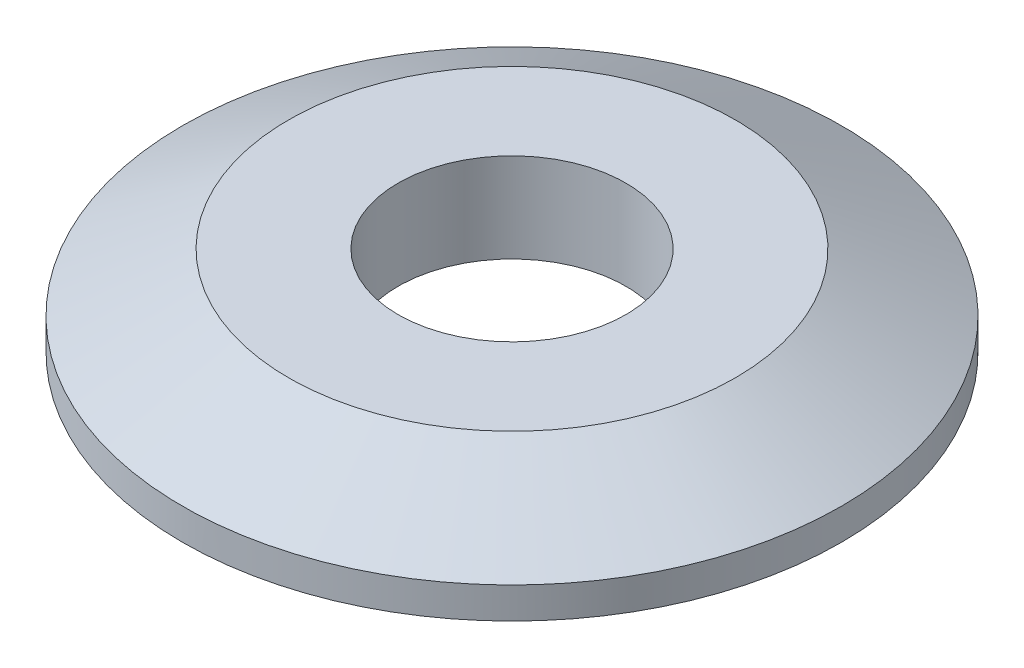
ISO-10303-21;
HEADER;
FILE_DESCRIPTION(('STEP AP214'),'2;1');
FILE_NAME('part.step','',(''),(''),'','','');
FILE_SCHEMA(('AUTOMOTIVE_DESIGN { 1 0 10303 214 1 1 1 1 }'));
ENDSEC;
DATA;
#1=APPLICATION_CONTEXT('core data for automotive mechanical design processes');
#2=APPLICATION_PROTOCOL_DEFINITION('international standard','automotive_design',2000,#1);
#3=PRODUCT_CONTEXT('',#1,'mechanical');
#4=PRODUCT('Part','Part','',(#3));
#5=PRODUCT_RELATED_PRODUCT_CATEGORY('part','',(#4));
#6=PRODUCT_DEFINITION_FORMATION('','',#4);
#7=PRODUCT_DEFINITION_CONTEXT('part definition',#1,'design');
#8=PRODUCT_DEFINITION('design','',#6,#7);
#9=PRODUCT_DEFINITION_SHAPE('','',#8);
#10=(LENGTH_UNIT() NAMED_UNIT(*) SI_UNIT(.MILLI.,.METRE.));
#11=(NAMED_UNIT(*) PLANE_ANGLE_UNIT() SI_UNIT($,.RADIAN.));
#12=(NAMED_UNIT(*) SI_UNIT($,.STERADIAN.) SOLID_ANGLE_UNIT());
#13=UNCERTAINTY_MEASURE_WITH_UNIT(LENGTH_MEASURE(1.E-05),#10,'distance_accuracy_value','');
#14=(GEOMETRIC_REPRESENTATION_CONTEXT(3) GLOBAL_UNCERTAINTY_ASSIGNED_CONTEXT((#13)) GLOBAL_UNIT_ASSIGNED_CONTEXT((#10,
#11,#12)) REPRESENTATION_CONTEXT('',''));
#15=CARTESIAN_POINT('',(0.,0.,0.));
#16=DIRECTION('',(0.,0.,1.));
#17=DIRECTION('',(1.,0.,0.));
#18=AXIS2_PLACEMENT_3D('',#15,#16,#17);
#19=CARTESIAN_POINT('',(0.,2.,0.));
#20=DIRECTION('',(0.,1.,0.));
#21=DIRECTION('',(0.,0.,1.));
#22=AXIS2_PLACEMENT_3D('',#19,#20,#21);
#23=PLANE('',#22);
#24=CARTESIAN_POINT('',(0.,2.,0.));
#25=DIRECTION('',(0.,-1.,0.));
#26=DIRECTION('',(1.,0.,0.));
#27=AXIS2_PLACEMENT_3D('',#24,#25,#26);
#28=CIRCLE('',#27,5.);
#29=CARTESIAN_POINT('',(5.,2.,0.));
#30=VERTEX_POINT('',#29);
#31=EDGE_CURVE('E50',#30,#30,#28,.T.);
#32=ORIENTED_EDGE('',*,*,#31,.F.);
#33=EDGE_LOOP('',(#32));
#34=FACE_BOUND('',#33,.T.);
#35=CARTESIAN_POINT('',(0.,2.,0.));
#36=DIRECTION('',(0.,1.,0.));
#37=DIRECTION('',(0.,0.,1.));
#38=AXIS2_PLACEMENT_3D('',#35,#36,#37);
#39=CIRCLE('',#38,2.55);
#40=CARTESIAN_POINT('',(0.,2.,2.55));
#41=VERTEX_POINT('',#40);
#42=EDGE_CURVE('E37',#41,#41,#39,.T.);
#43=ORIENTED_EDGE('',*,*,#42,.F.);
#44=EDGE_LOOP('',(#43));
#45=FACE_BOUND('',#44,.T.);
#46=ADVANCED_FACE('F30',(#34,#45),#23,.T.);
#47=CARTESIAN_POINT('',(0.,0.,0.));
#48=DIRECTION('',(0.,1.,0.));
#49=DIRECTION('',(0.,0.,1.));
#50=AXIS2_PLACEMENT_3D('',#47,#48,#49);
#51=PLANE('',#50);
#52=CARTESIAN_POINT('',(0.,0.,0.));
#53=DIRECTION('',(0.,1.,0.));
#54=DIRECTION('',(0.,0.,1.));
#55=AXIS2_PLACEMENT_3D('',#52,#53,#54);
#56=CIRCLE('',#55,7.375);
#57=CARTESIAN_POINT('',(0.,0.,7.375));
#58=VERTEX_POINT('',#57);
#59=EDGE_CURVE('E10',#58,#58,#56,.T.);
#60=ORIENTED_EDGE('',*,*,#59,.F.);
#61=EDGE_LOOP('',(#60));
#62=FACE_BOUND('',#61,.T.);
#63=CARTESIAN_POINT('',(0.,0.,0.));
#64=DIRECTION('',(0.,1.,0.));
#65=DIRECTION('',(0.,0.,1.));
#66=AXIS2_PLACEMENT_3D('',#63,#64,#65);
#67=CIRCLE('',#66,2.55);
#68=CARTESIAN_POINT('',(0.,0.,2.55));
#69=VERTEX_POINT('',#68);
#70=EDGE_CURVE('E41',#69,#69,#67,.T.);
#71=ORIENTED_EDGE('',*,*,#70,.T.);
#72=EDGE_LOOP('',(#71));
#73=FACE_BOUND('',#72,.T.);
#74=ADVANCED_FACE('F58',(#62,#73),#51,.F.);
#75=CARTESIAN_POINT('',(0.,2.,0.));
#76=DIRECTION('',(0.,-1.,0.));
#77=DIRECTION('',(0.,0.,-1.));
#78=AXIS2_PLACEMENT_3D('',#75,#76,#77);
#79=CYLINDRICAL_SURFACE('',#78,7.375);
#80=CARTESIAN_POINT('',(0.,0.700000000000006,0.));
#81=DIRECTION('',(0.,-1.,0.));
#82=DIRECTION('',(1.,0.,0.));
#83=AXIS2_PLACEMENT_3D('',#80,#81,#82);
#84=CIRCLE('',#83,7.375);
#85=CARTESIAN_POINT('',(7.375,0.7,0.));
#86=VERTEX_POINT('',#85);
#87=EDGE_CURVE('E46',#86,#86,#84,.T.);
#88=ORIENTED_EDGE('',*,*,#87,.T.);
#89=EDGE_LOOP('',(#88));
#90=FACE_BOUND('',#89,.T.);
#91=ORIENTED_EDGE('',*,*,#59,.T.);
#92=EDGE_LOOP('',(#91));
#93=FACE_BOUND('',#92,.T.);
#94=ADVANCED_FACE('F32',(#90,#93),#79,.T.);
#95=CARTESIAN_POINT('',(0.,2.,0.));
#96=DIRECTION('',(0.,-1.,0.));
#97=DIRECTION('',(0.,0.,-1.));
#98=AXIS2_PLACEMENT_3D('',#95,#96,#97);
#99=CYLINDRICAL_SURFACE('',#98,2.55);
#100=ORIENTED_EDGE('',*,*,#42,.T.);
#101=EDGE_LOOP('',(#100));
#102=FACE_BOUND('',#101,.T.);
#103=ORIENTED_EDGE('',*,*,#70,.F.);
#104=EDGE_LOOP('',(#103));
#105=FACE_BOUND('',#104,.T.);
#106=ADVANCED_FACE('F65',(#102,#105),#99,.F.);
#107=CARTESIAN_POINT('',(0.,2.,0.));
#108=DIRECTION('',(0.,-1.,0.));
#109=DIRECTION('',(1.,0.,0.));
#110=AXIS2_PLACEMENT_3D('',#107,#108,#109);
#111=CONICAL_SURFACE('',#110,5.,1.06997576683041);
#112=ORIENTED_EDGE('',*,*,#87,.F.);
#113=EDGE_LOOP('',(#112));
#114=FACE_BOUND('',#113,.T.);
#115=ORIENTED_EDGE('',*,*,#31,.T.);
#116=EDGE_LOOP('',(#115));
#117=FACE_BOUND('',#116,.T.);
#118=ADVANCED_FACE('F54',(#114,#117),#111,.T.);
#119=CLOSED_SHELL('',(#46,#74,#94,#106,#118));
#120=MANIFOLD_SOLID_BREP('B2',#119);
#121=ADVANCED_BREP_SHAPE_REPRESENTATION('',(#18,#120),#14);
#122=SHAPE_DEFINITION_REPRESENTATION(#9,#121);
ENDSEC;
END-ISO-10303-21;
